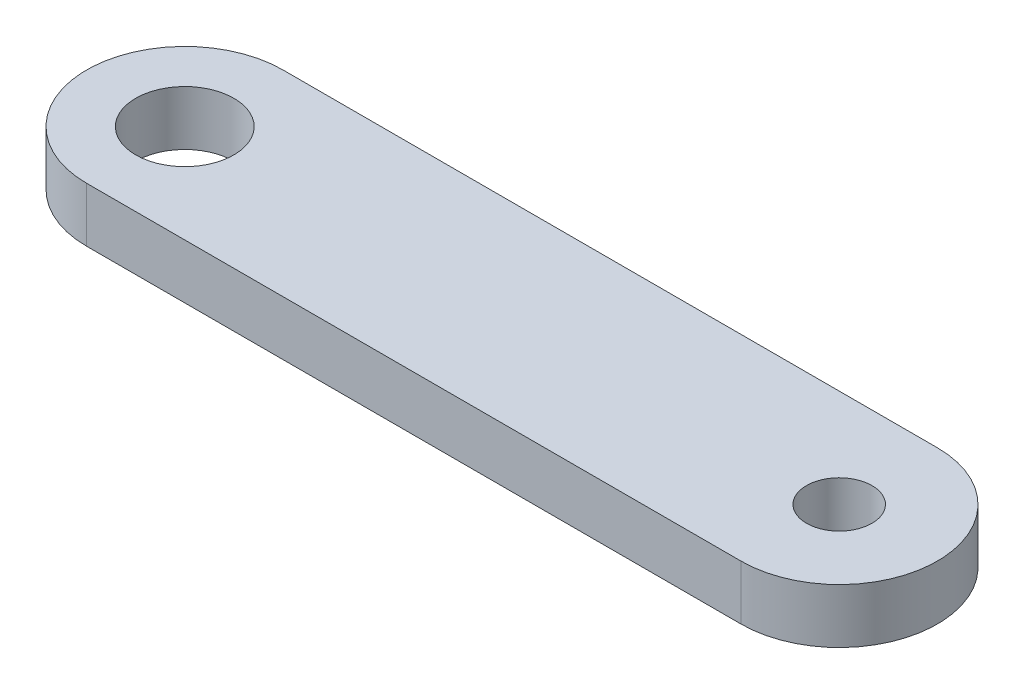
ISO-10303-21;
HEADER;
FILE_DESCRIPTION(('STEP AP214'),'2;1');
FILE_NAME('part.step','',(''),(''),'','','');
FILE_SCHEMA(('AUTOMOTIVE_DESIGN { 1 0 10303 214 1 1 1 1 }'));
ENDSEC;
DATA;
#1=APPLICATION_CONTEXT('core data for automotive mechanical design processes');
#2=APPLICATION_PROTOCOL_DEFINITION('international standard','automotive_design',2000,#1);
#3=PRODUCT_CONTEXT('',#1,'mechanical');
#4=PRODUCT('Part','Part','',(#3));
#5=PRODUCT_RELATED_PRODUCT_CATEGORY('part','',(#4));
#6=PRODUCT_DEFINITION_FORMATION('','',#4);
#7=PRODUCT_DEFINITION_CONTEXT('part definition',#1,'design');
#8=PRODUCT_DEFINITION('design','',#6,#7);
#9=PRODUCT_DEFINITION_SHAPE('','',#8);
#10=(LENGTH_UNIT() NAMED_UNIT(*) SI_UNIT(.MILLI.,.METRE.));
#11=(NAMED_UNIT(*) PLANE_ANGLE_UNIT() SI_UNIT($,.RADIAN.));
#12=(NAMED_UNIT(*) SI_UNIT($,.STERADIAN.) SOLID_ANGLE_UNIT());
#13=UNCERTAINTY_MEASURE_WITH_UNIT(LENGTH_MEASURE(1.E-05),#10,'distance_accuracy_value','');
#14=(GEOMETRIC_REPRESENTATION_CONTEXT(3) GLOBAL_UNCERTAINTY_ASSIGNED_CONTEXT((#13)) GLOBAL_UNIT_ASSIGNED_CONTEXT((#10,
#11,#12)) REPRESENTATION_CONTEXT('',''));
#15=CARTESIAN_POINT('',(0.,0.,0.));
#16=DIRECTION('',(0.,0.,1.));
#17=DIRECTION('',(1.,0.,0.));
#18=AXIS2_PLACEMENT_3D('',#15,#16,#17);
#19=CARTESIAN_POINT('',(0.,5.,0.));
#20=DIRECTION('',(0.,1.,0.));
#21=DIRECTION('',(0.,0.,1.));
#22=AXIS2_PLACEMENT_3D('',#19,#20,#21);
#23=PLANE('',#22);
#24=CARTESIAN_POINT('',(0.,5.,0.));
#25=DIRECTION('',(0.,1.,0.));
#26=DIRECTION('',(0.,0.,1.));
#27=AXIS2_PLACEMENT_3D('',#24,#25,#26);
#28=CIRCLE('',#27,4.5);
#29=CARTESIAN_POINT('',(0.,5.,4.5));
#30=VERTEX_POINT('',#29);
#31=EDGE_CURVE('E104',#30,#30,#28,.T.);
#32=ORIENTED_EDGE('',*,*,#31,.F.);
#33=EDGE_LOOP('',(#32));
#34=FACE_BOUND('',#33,.T.);
#35=CARTESIAN_POINT('',(0.,5.,0.));
#36=DIRECTION('',(0.,1.,0.));
#37=DIRECTION('',(0.,0.,1.));
#38=AXIS2_PLACEMENT_3D('',#35,#36,#37);
#39=CIRCLE('',#38,9.);
#40=CARTESIAN_POINT('',(0.,5.,-9.));
#41=VERTEX_POINT('',#40);
#42=CARTESIAN_POINT('',(0.,5.,9.));
#43=VERTEX_POINT('',#42);
#44=EDGE_CURVE('E89',#41,#43,#39,.T.);
#45=ORIENTED_EDGE('',*,*,#44,.T.);
#46=DIRECTION('',(1.,0.,0.));
#47=VECTOR('',#46,1.);
#48=CARTESIAN_POINT('',(0.,5.,9.));
#49=LINE('',#48,#47);
#50=CARTESIAN_POINT('',(60.,5.,9.));
#51=VERTEX_POINT('',#50);
#52=EDGE_CURVE('E84',#43,#51,#49,.T.);
#53=ORIENTED_EDGE('',*,*,#52,.T.);
#54=CARTESIAN_POINT('',(60.,5.,0.));
#55=DIRECTION('',(0.,1.,0.));
#56=DIRECTION('',(0.,0.,1.));
#57=AXIS2_PLACEMENT_3D('',#54,#55,#56);
#58=CIRCLE('',#57,9.);
#59=CARTESIAN_POINT('',(60.,5.,-9.));
#60=VERTEX_POINT('',#59);
#61=EDGE_CURVE('E87',#51,#60,#58,.T.);
#62=ORIENTED_EDGE('',*,*,#61,.T.);
#63=DIRECTION('',(-1.,0.,0.));
#64=VECTOR('',#63,1.);
#65=CARTESIAN_POINT('',(0.,5.,-9.));
#66=LINE('',#65,#64);
#67=EDGE_CURVE('E54',#60,#41,#66,.T.);
#68=ORIENTED_EDGE('',*,*,#67,.T.);
#69=EDGE_LOOP('',(#45,#53,#62,#68));
#70=FACE_BOUND('',#69,.T.);
#71=CARTESIAN_POINT('',(60.,5.,0.));
#72=DIRECTION('',(0.,1.,0.));
#73=DIRECTION('',(0.,0.,1.));
#74=AXIS2_PLACEMENT_3D('',#71,#72,#73);
#75=CIRCLE('',#74,3.00000000000001);
#76=CARTESIAN_POINT('',(60.,5.,3.00000000000001));
#77=VERTEX_POINT('',#76);
#78=EDGE_CURVE('E119',#77,#77,#75,.T.);
#79=ORIENTED_EDGE('',*,*,#78,.F.);
#80=EDGE_LOOP('',(#79));
#81=FACE_BOUND('',#80,.T.);
#82=ADVANCED_FACE('F37',(#34,#70,#81),#23,.T.);
#83=CARTESIAN_POINT('',(0.,0.,0.));
#84=DIRECTION('',(0.,1.,0.));
#85=DIRECTION('',(0.,0.,1.));
#86=AXIS2_PLACEMENT_3D('',#83,#84,#85);
#87=PLANE('',#86);
#88=CARTESIAN_POINT('',(0.,0.,0.));
#89=DIRECTION('',(0.,1.,0.));
#90=DIRECTION('',(0.,0.,1.));
#91=AXIS2_PLACEMENT_3D('',#88,#89,#90);
#92=CIRCLE('',#91,4.5);
#93=CARTESIAN_POINT('',(0.,0.,4.5));
#94=VERTEX_POINT('',#93);
#95=EDGE_CURVE('E116',#94,#94,#92,.T.);
#96=ORIENTED_EDGE('',*,*,#95,.T.);
#97=EDGE_LOOP('',(#96));
#98=FACE_BOUND('',#97,.T.);
#99=CARTESIAN_POINT('',(0.,0.,0.));
#100=DIRECTION('',(0.,1.,0.));
#101=DIRECTION('',(0.,0.,1.));
#102=AXIS2_PLACEMENT_3D('',#99,#100,#101);
#103=CIRCLE('',#102,9.);
#104=CARTESIAN_POINT('',(0.,0.,-9.));
#105=VERTEX_POINT('',#104);
#106=CARTESIAN_POINT('',(0.,0.,9.));
#107=VERTEX_POINT('',#106);
#108=EDGE_CURVE('E101',#105,#107,#103,.T.);
#109=ORIENTED_EDGE('',*,*,#108,.F.);
#110=DIRECTION('',(-1.,0.,0.));
#111=VECTOR('',#110,1.);
#112=CARTESIAN_POINT('',(0.,0.,-9.));
#113=LINE('',#112,#111);
#114=CARTESIAN_POINT('',(60.,0.,-9.));
#115=VERTEX_POINT('',#114);
#116=EDGE_CURVE('E77',#115,#105,#113,.T.);
#117=ORIENTED_EDGE('',*,*,#116,.F.);
#118=CARTESIAN_POINT('',(60.,0.,0.));
#119=DIRECTION('',(0.,1.,0.));
#120=DIRECTION('',(0.,0.,1.));
#121=AXIS2_PLACEMENT_3D('',#118,#119,#120);
#122=CIRCLE('',#121,9.);
#123=CARTESIAN_POINT('',(60.,0.,9.));
#124=VERTEX_POINT('',#123);
#125=EDGE_CURVE('E71',#124,#115,#122,.T.);
#126=ORIENTED_EDGE('',*,*,#125,.F.);
#127=DIRECTION('',(1.,0.,0.));
#128=VECTOR('',#127,1.);
#129=CARTESIAN_POINT('',(0.,0.,9.));
#130=LINE('',#129,#128);
#131=EDGE_CURVE('E93',#107,#124,#130,.T.);
#132=ORIENTED_EDGE('',*,*,#131,.F.);
#133=EDGE_LOOP('',(#109,#117,#126,#132));
#134=FACE_BOUND('',#133,.T.);
#135=CARTESIAN_POINT('',(60.,0.,0.));
#136=DIRECTION('',(0.,1.,0.));
#137=DIRECTION('',(0.,0.,1.));
#138=AXIS2_PLACEMENT_3D('',#135,#136,#137);
#139=CIRCLE('',#138,3.00000000000001);
#140=CARTESIAN_POINT('',(60.,0.,3.00000000000001));
#141=VERTEX_POINT('',#140);
#142=EDGE_CURVE('E122',#141,#141,#139,.T.);
#143=ORIENTED_EDGE('',*,*,#142,.T.);
#144=EDGE_LOOP('',(#143));
#145=FACE_BOUND('',#144,.T.);
#146=ADVANCED_FACE('F112',(#98,#134,#145),#87,.F.);
#147=CARTESIAN_POINT('',(0.,5.,0.));
#148=DIRECTION('',(0.,-1.,0.));
#149=DIRECTION('',(0.,0.,-1.));
#150=AXIS2_PLACEMENT_3D('',#147,#148,#149);
#151=CYLINDRICAL_SURFACE('',#150,9.);
#152=ORIENTED_EDGE('',*,*,#108,.T.);
#153=DIRECTION('',(0.,-1.,0.));
#154=VECTOR('',#153,1.);
#155=CARTESIAN_POINT('',(0.,5.,9.));
#156=LINE('',#155,#154);
#157=EDGE_CURVE('E11',#43,#107,#156,.T.);
#158=ORIENTED_EDGE('',*,*,#157,.F.);
#159=ORIENTED_EDGE('',*,*,#44,.F.);
#160=DIRECTION('',(0.,-1.,0.));
#161=VECTOR('',#160,1.);
#162=CARTESIAN_POINT('',(0.,5.,-9.));
#163=LINE('',#162,#161);
#164=EDGE_CURVE('E97',#41,#105,#163,.T.);
#165=ORIENTED_EDGE('',*,*,#164,.T.);
#166=EDGE_LOOP('',(#152,#158,#159,#165));
#167=FACE_BOUND('',#166,.T.);
#168=ADVANCED_FACE('F39',(#167),#151,.T.);
#169=CARTESIAN_POINT('',(0.,5.,9.));
#170=DIRECTION('',(0.,0.,-1.));
#171=DIRECTION('',(-1.,0.,0.));
#172=AXIS2_PLACEMENT_3D('',#169,#170,#171);
#173=PLANE('',#172);
#174=ORIENTED_EDGE('',*,*,#131,.T.);
#175=DIRECTION('',(0.,-1.,0.));
#176=VECTOR('',#175,1.);
#177=CARTESIAN_POINT('',(60.,5.,9.));
#178=LINE('',#177,#176);
#179=EDGE_CURVE('E46',#51,#124,#178,.T.);
#180=ORIENTED_EDGE('',*,*,#179,.F.);
#181=ORIENTED_EDGE('',*,*,#52,.F.);
#182=ORIENTED_EDGE('',*,*,#157,.T.);
#183=EDGE_LOOP('',(#174,#180,#181,#182));
#184=FACE_BOUND('',#183,.T.);
#185=ADVANCED_FACE('F92',(#184),#173,.F.);
#186=CARTESIAN_POINT('',(60.,5.,0.));
#187=DIRECTION('',(0.,-1.,0.));
#188=DIRECTION('',(0.,0.,-1.));
#189=AXIS2_PLACEMENT_3D('',#186,#187,#188);
#190=CYLINDRICAL_SURFACE('',#189,9.);
#191=ORIENTED_EDGE('',*,*,#125,.T.);
#192=DIRECTION('',(0.,-1.,0.));
#193=VECTOR('',#192,1.);
#194=CARTESIAN_POINT('',(60.,5.,-9.));
#195=LINE('',#194,#193);
#196=EDGE_CURVE('E94',#60,#115,#195,.T.);
#197=ORIENTED_EDGE('',*,*,#196,.F.);
#198=ORIENTED_EDGE('',*,*,#61,.F.);
#199=ORIENTED_EDGE('',*,*,#179,.T.);
#200=EDGE_LOOP('',(#191,#197,#198,#199));
#201=FACE_BOUND('',#200,.T.);
#202=ADVANCED_FACE('F95',(#201),#190,.T.);
#203=CARTESIAN_POINT('',(0.,5.,-9.));
#204=DIRECTION('',(0.,0.,1.));
#205=DIRECTION('',(1.,0.,0.));
#206=AXIS2_PLACEMENT_3D('',#203,#204,#205);
#207=PLANE('',#206);
#208=ORIENTED_EDGE('',*,*,#116,.T.);
#209=ORIENTED_EDGE('',*,*,#164,.F.);
#210=ORIENTED_EDGE('',*,*,#67,.F.);
#211=ORIENTED_EDGE('',*,*,#196,.T.);
#212=EDGE_LOOP('',(#208,#209,#210,#211));
#213=FACE_BOUND('',#212,.T.);
#214=ADVANCED_FACE('F109',(#213),#207,.F.);
#215=CARTESIAN_POINT('',(0.,5.,0.));
#216=DIRECTION('',(0.,-1.,0.));
#217=DIRECTION('',(0.,0.,-1.));
#218=AXIS2_PLACEMENT_3D('',#215,#216,#217);
#219=CYLINDRICAL_SURFACE('',#218,4.5);
#220=ORIENTED_EDGE('',*,*,#31,.T.);
#221=EDGE_LOOP('',(#220));
#222=FACE_BOUND('',#221,.T.);
#223=ORIENTED_EDGE('',*,*,#95,.F.);
#224=EDGE_LOOP('',(#223));
#225=FACE_BOUND('',#224,.T.);
#226=ADVANCED_FACE('F140',(#222,#225),#219,.F.);
#227=CARTESIAN_POINT('',(60.,5.,0.));
#228=DIRECTION('',(0.,-1.,0.));
#229=DIRECTION('',(0.,0.,-1.));
#230=AXIS2_PLACEMENT_3D('',#227,#228,#229);
#231=CYLINDRICAL_SURFACE('',#230,3.00000000000001);
#232=ORIENTED_EDGE('',*,*,#78,.T.);
#233=EDGE_LOOP('',(#232));
#234=FACE_BOUND('',#233,.T.);
#235=ORIENTED_EDGE('',*,*,#142,.F.);
#236=EDGE_LOOP('',(#235));
#237=FACE_BOUND('',#236,.T.);
#238=ADVANCED_FACE('F128',(#234,#237),#231,.F.);
#239=CLOSED_SHELL('',(#82,#146,#168,#185,#202,#214,#226,#238));
#240=MANIFOLD_SOLID_BREP('B2',#239);
#241=ADVANCED_BREP_SHAPE_REPRESENTATION('',(#18,#240),#14);
#242=SHAPE_DEFINITION_REPRESENTATION(#9,#241);
ENDSEC;
END-ISO-10303-21;
